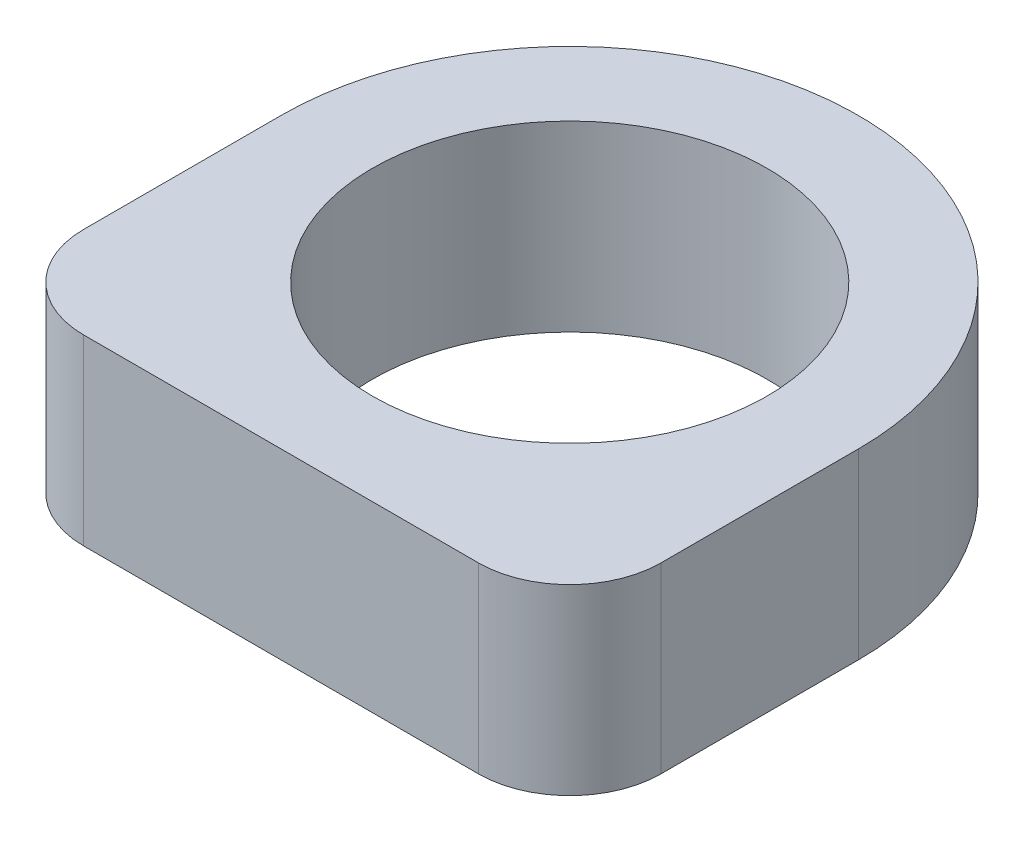
ISO-10303-21;
HEADER;
FILE_DESCRIPTION(('STEP AP214'),'2;1');
FILE_NAME('part.step','',(''),(''),'','','');
FILE_SCHEMA(('AUTOMOTIVE_DESIGN { 1 0 10303 214 1 1 1 1 }'));
ENDSEC;
DATA;
#1=APPLICATION_CONTEXT('core data for automotive mechanical design processes');
#2=APPLICATION_PROTOCOL_DEFINITION('international standard','automotive_design',2000,#1);
#3=PRODUCT_CONTEXT('',#1,'mechanical');
#4=PRODUCT('Part','Part','',(#3));
#5=PRODUCT_RELATED_PRODUCT_CATEGORY('part','',(#4));
#6=PRODUCT_DEFINITION_FORMATION('','',#4);
#7=PRODUCT_DEFINITION_CONTEXT('part definition',#1,'design');
#8=PRODUCT_DEFINITION('design','',#6,#7);
#9=PRODUCT_DEFINITION_SHAPE('','',#8);
#10=(LENGTH_UNIT() NAMED_UNIT(*) SI_UNIT(.MILLI.,.METRE.));
#11=(NAMED_UNIT(*) PLANE_ANGLE_UNIT() SI_UNIT($,.RADIAN.));
#12=(NAMED_UNIT(*) SI_UNIT($,.STERADIAN.) SOLID_ANGLE_UNIT());
#13=UNCERTAINTY_MEASURE_WITH_UNIT(LENGTH_MEASURE(1.E-05),#10,'distance_accuracy_value','');
#14=(GEOMETRIC_REPRESENTATION_CONTEXT(3) GLOBAL_UNCERTAINTY_ASSIGNED_CONTEXT((#13)) GLOBAL_UNIT_ASSIGNED_CONTEXT((#10,
#11,#12)) REPRESENTATION_CONTEXT('',''));
#15=CARTESIAN_POINT('',(0.,0.,0.));
#16=DIRECTION('',(0.,0.,1.));
#17=DIRECTION('',(1.,0.,0.));
#18=AXIS2_PLACEMENT_3D('',#15,#16,#17);
#19=CARTESIAN_POINT('',(-2.71253870759835,10.,-1.61598050665433));
#20=DIRECTION('',(0.,-1.,0.));
#21=DIRECTION('',(0.,0.,-1.));
#22=AXIS2_PLACEMENT_3D('',#19,#20,#21);
#23=CYLINDRICAL_SURFACE('',#22,15.8);
#24=CARTESIAN_POINT('',(-2.71253870759835,0.,-1.61598050665433));
#25=DIRECTION('',(0.,1.,0.));
#26=DIRECTION('',(0.,0.,1.));
#27=AXIS2_PLACEMENT_3D('',#24,#25,#26);
#28=CIRCLE('',#27,15.8);
#29=CARTESIAN_POINT('',(13.0874612924016,0.,-1.61598050665433));
#30=VERTEX_POINT('',#29);
#31=CARTESIAN_POINT('',(-18.5125387075984,0.,-1.61598050665433));
#32=VERTEX_POINT('',#31);
#33=EDGE_CURVE('E107',#30,#32,#28,.T.);
#34=ORIENTED_EDGE('',*,*,#33,.T.);
#35=DIRECTION('',(0.,-1.,0.));
#36=VECTOR('',#35,1.);
#37=CARTESIAN_POINT('',(-18.5125387075984,10.,-1.61598050665433));
#38=LINE('',#37,#36);
#39=CARTESIAN_POINT('',(-18.5125387075984,10.,-1.61598050665433));
#40=VERTEX_POINT('',#39);
#41=EDGE_CURVE('E93',#40,#32,#38,.T.);
#42=ORIENTED_EDGE('',*,*,#41,.F.);
#43=CARTESIAN_POINT('',(-2.71253870759835,10.,-1.61598050665433));
#44=DIRECTION('',(0.,1.,0.));
#45=DIRECTION('',(0.,0.,1.));
#46=AXIS2_PLACEMENT_3D('',#43,#44,#45);
#47=CIRCLE('',#46,15.8);
#48=CARTESIAN_POINT('',(13.0874612924016,10.,-1.61598050665433));
#49=VERTEX_POINT('',#48);
#50=EDGE_CURVE('E97',#49,#40,#47,.T.);
#51=ORIENTED_EDGE('',*,*,#50,.F.);
#52=DIRECTION('',(0.,-1.,0.));
#53=VECTOR('',#52,1.);
#54=CARTESIAN_POINT('',(13.0874612924016,10.,-1.61598050665433));
#55=LINE('',#54,#53);
#56=EDGE_CURVE('E109',#49,#30,#55,.T.);
#57=ORIENTED_EDGE('',*,*,#56,.T.);
#58=EDGE_LOOP('',(#34,#42,#51,#57));
#59=FACE_BOUND('',#58,.T.);
#60=ADVANCED_FACE('F35',(#59),#23,.T.);
#61=CARTESIAN_POINT('',(-18.5125387075984,10.,0.));
#62=DIRECTION('',(1.,0.,0.));
#63=DIRECTION('',(0.,0.,-1.));
#64=AXIS2_PLACEMENT_3D('',#61,#62,#63);
#65=PLANE('',#64);
#66=DIRECTION('',(0.,0.,1.));
#67=VECTOR('',#66,1.);
#68=CARTESIAN_POINT('',(-18.5125387075984,0.,0.));
#69=LINE('',#68,#67);
#70=CARTESIAN_POINT('',(-18.5125387075983,0.,9.18401949334567));
#71=VERTEX_POINT('',#70);
#72=EDGE_CURVE('E137',#32,#71,#69,.T.);
#73=ORIENTED_EDGE('',*,*,#72,.T.);
#74=DIRECTION('',(0.,-1.,0.));
#75=VECTOR('',#74,1.);
#76=CARTESIAN_POINT('',(-18.5125387075983,10.,9.18401949334567));
#77=LINE('',#76,#75);
#78=CARTESIAN_POINT('',(-18.5125387075983,10.,9.18401949334567));
#79=VERTEX_POINT('',#78);
#80=EDGE_CURVE('E58',#71,#79,#77,.F.);
#81=ORIENTED_EDGE('',*,*,#80,.T.);
#82=DIRECTION('',(0.,0.,1.));
#83=VECTOR('',#82,1.);
#84=CARTESIAN_POINT('',(-18.5125387075984,10.,0.));
#85=LINE('',#84,#83);
#86=EDGE_CURVE('E89',#40,#79,#85,.T.);
#87=ORIENTED_EDGE('',*,*,#86,.F.);
#88=ORIENTED_EDGE('',*,*,#41,.T.);
#89=EDGE_LOOP('',(#73,#81,#87,#88));
#90=FACE_BOUND('',#89,.T.);
#91=ADVANCED_FACE('F91',(#90),#65,.F.);
#92=CARTESIAN_POINT('',(0.,10.,14.1840194933457));
#93=DIRECTION('',(0.,0.,-1.));
#94=DIRECTION('',(-1.,0.,0.));
#95=AXIS2_PLACEMENT_3D('',#92,#93,#94);
#96=PLANE('',#95);
#97=DIRECTION('',(1.,0.,0.));
#98=VECTOR('',#97,1.);
#99=CARTESIAN_POINT('',(0.,10.,14.1840194933457));
#100=LINE('',#99,#98);
#101=CARTESIAN_POINT('',(-13.5125387075984,10.,14.1840194933457));
#102=VERTEX_POINT('',#101);
#103=CARTESIAN_POINT('',(8.08746129240165,10.,14.1840194933457));
#104=VERTEX_POINT('',#103);
#105=EDGE_CURVE('E96',#102,#104,#100,.T.);
#106=ORIENTED_EDGE('',*,*,#105,.F.);
#107=DIRECTION('',(0.,-1.,0.));
#108=VECTOR('',#107,1.);
#109=CARTESIAN_POINT('',(-13.5125387075984,10.,14.1840194933457));
#110=LINE('',#109,#108);
#111=CARTESIAN_POINT('',(-13.5125387075984,0.,14.1840194933457));
#112=VERTEX_POINT('',#111);
#113=EDGE_CURVE('E111',#102,#112,#110,.T.);
#114=ORIENTED_EDGE('',*,*,#113,.T.);
#115=DIRECTION('',(1.,0.,0.));
#116=VECTOR('',#115,1.);
#117=CARTESIAN_POINT('',(0.,0.,14.1840194933457));
#118=LINE('',#117,#116);
#119=CARTESIAN_POINT('',(8.08746129240165,0.,14.1840194933457));
#120=VERTEX_POINT('',#119);
#121=EDGE_CURVE('E138',#112,#120,#118,.T.);
#122=ORIENTED_EDGE('',*,*,#121,.T.);
#123=DIRECTION('',(0.,-1.,0.));
#124=VECTOR('',#123,1.);
#125=CARTESIAN_POINT('',(8.08746129240165,10.,14.1840194933457));
#126=LINE('',#125,#124);
#127=EDGE_CURVE('E108',#120,#104,#126,.F.);
#128=ORIENTED_EDGE('',*,*,#127,.T.);
#129=EDGE_LOOP('',(#106,#114,#122,#128));
#130=FACE_BOUND('',#129,.T.);
#131=ADVANCED_FACE('F128',(#130),#96,.F.);
#132=CARTESIAN_POINT('',(13.0874612924016,10.,0.));
#133=DIRECTION('',(1.,0.,0.));
#134=DIRECTION('',(0.,0.,-1.));
#135=AXIS2_PLACEMENT_3D('',#132,#133,#134);
#136=PLANE('',#135);
#137=DIRECTION('',(0.,0.,1.));
#138=VECTOR('',#137,1.);
#139=CARTESIAN_POINT('',(13.0874612924016,10.,0.));
#140=LINE('',#139,#138);
#141=CARTESIAN_POINT('',(13.0874612924017,10.,9.18401949334567));
#142=VERTEX_POINT('',#141);
#143=EDGE_CURVE('E102',#49,#142,#140,.T.);
#144=ORIENTED_EDGE('',*,*,#143,.T.);
#145=DIRECTION('',(0.,-1.,0.));
#146=VECTOR('',#145,1.);
#147=CARTESIAN_POINT('',(13.0874612924017,0.,9.18401949334567));
#148=LINE('',#147,#146);
#149=CARTESIAN_POINT('',(13.0874612924017,0.,9.18401949334567));
#150=VERTEX_POINT('',#149);
#151=EDGE_CURVE('E11',#142,#150,#148,.T.);
#152=ORIENTED_EDGE('',*,*,#151,.T.);
#153=DIRECTION('',(0.,0.,1.));
#154=VECTOR('',#153,1.);
#155=CARTESIAN_POINT('',(13.0874612924016,0.,0.));
#156=LINE('',#155,#154);
#157=EDGE_CURVE('E140',#30,#150,#156,.T.);
#158=ORIENTED_EDGE('',*,*,#157,.F.);
#159=ORIENTED_EDGE('',*,*,#56,.F.);
#160=EDGE_LOOP('',(#144,#152,#158,#159));
#161=FACE_BOUND('',#160,.T.);
#162=ADVANCED_FACE('F151',(#161),#136,.T.);
#163=CARTESIAN_POINT('',(-2.71253870759835,10.,-1.61598050665433));
#164=DIRECTION('',(0.,-1.,0.));
#165=DIRECTION('',(0.,0.,-1.));
#166=AXIS2_PLACEMENT_3D('',#163,#164,#165);
#167=CYLINDRICAL_SURFACE('',#166,10.8);
#168=CARTESIAN_POINT('',(-2.71253870759835,10.,-1.61598050665433));
#169=DIRECTION('',(0.,1.,0.));
#170=DIRECTION('',(0.,0.,1.));
#171=AXIS2_PLACEMENT_3D('',#168,#169,#170);
#172=CIRCLE('',#171,10.8);
#173=CARTESIAN_POINT('',(-2.71253870759835,10.,9.18401949334567));
#174=VERTEX_POINT('',#173);
#175=EDGE_CURVE('E113',#174,#174,#172,.T.);
#176=ORIENTED_EDGE('',*,*,#175,.T.);
#177=EDGE_LOOP('',(#176));
#178=FACE_BOUND('',#177,.T.);
#179=CARTESIAN_POINT('',(-2.71253870759835,0.,-1.61598050665433));
#180=DIRECTION('',(0.,1.,0.));
#181=DIRECTION('',(0.,0.,1.));
#182=AXIS2_PLACEMENT_3D('',#179,#180,#181);
#183=CIRCLE('',#182,10.8);
#184=CARTESIAN_POINT('',(-2.71253870759835,0.,9.18401949334567));
#185=VERTEX_POINT('',#184);
#186=EDGE_CURVE('E104',#185,#185,#183,.T.);
#187=ORIENTED_EDGE('',*,*,#186,.F.);
#188=EDGE_LOOP('',(#187));
#189=FACE_BOUND('',#188,.T.);
#190=ADVANCED_FACE('F149',(#178,#189),#167,.F.);
#191=CARTESIAN_POINT('',(0.,10.,0.));
#192=DIRECTION('',(0.,1.,0.));
#193=DIRECTION('',(0.,0.,1.));
#194=AXIS2_PLACEMENT_3D('',#191,#192,#193);
#195=PLANE('',#194);
#196=ORIENTED_EDGE('',*,*,#86,.T.);
#197=CARTESIAN_POINT('',(-13.5125387075984,10.,9.18401949334567));
#198=DIRECTION('',(0.,1.,0.));
#199=DIRECTION('',(0.,0.,1.));
#200=AXIS2_PLACEMENT_3D('',#197,#198,#199);
#201=CIRCLE('',#200,5.);
#202=EDGE_CURVE('E43',#79,#102,#201,.T.);
#203=ORIENTED_EDGE('',*,*,#202,.T.);
#204=ORIENTED_EDGE('',*,*,#105,.T.);
#205=CARTESIAN_POINT('',(8.08746129240165,10.,9.18401949334567));
#206=DIRECTION('',(0.,1.,0.));
#207=DIRECTION('',(0.,0.,1.));
#208=AXIS2_PLACEMENT_3D('',#205,#206,#207);
#209=CIRCLE('',#208,5.);
#210=EDGE_CURVE('E50',#104,#142,#209,.T.);
#211=ORIENTED_EDGE('',*,*,#210,.T.);
#212=ORIENTED_EDGE('',*,*,#143,.F.);
#213=ORIENTED_EDGE('',*,*,#50,.T.);
#214=EDGE_LOOP('',(#196,#203,#204,#211,#212,#213));
#215=FACE_BOUND('',#214,.T.);
#216=ORIENTED_EDGE('',*,*,#175,.F.);
#217=EDGE_LOOP('',(#216));
#218=FACE_BOUND('',#217,.T.);
#219=ADVANCED_FACE('F100',(#215,#218),#195,.T.);
#220=CARTESIAN_POINT('',(0.,0.,0.));
#221=DIRECTION('',(0.,1.,0.));
#222=DIRECTION('',(0.,0.,1.));
#223=AXIS2_PLACEMENT_3D('',#220,#221,#222);
#224=PLANE('',#223);
#225=ORIENTED_EDGE('',*,*,#121,.F.);
#226=CARTESIAN_POINT('',(-13.5125387075984,0.,9.18401949334567));
#227=DIRECTION('',(0.,1.,0.));
#228=DIRECTION('',(0.,0.,1.));
#229=AXIS2_PLACEMENT_3D('',#226,#227,#228);
#230=CIRCLE('',#229,5.);
#231=EDGE_CURVE('E121',#112,#71,#230,.F.);
#232=ORIENTED_EDGE('',*,*,#231,.T.);
#233=ORIENTED_EDGE('',*,*,#72,.F.);
#234=ORIENTED_EDGE('',*,*,#33,.F.);
#235=ORIENTED_EDGE('',*,*,#157,.T.);
#236=CARTESIAN_POINT('',(8.08746129240165,0.,9.18401949334567));
#237=DIRECTION('',(0.,1.,0.));
#238=DIRECTION('',(0.,0.,1.));
#239=AXIS2_PLACEMENT_3D('',#236,#237,#238);
#240=CIRCLE('',#239,5.);
#241=EDGE_CURVE('E119',#150,#120,#240,.F.);
#242=ORIENTED_EDGE('',*,*,#241,.T.);
#243=EDGE_LOOP('',(#225,#232,#233,#234,#235,#242));
#244=FACE_BOUND('',#243,.T.);
#245=ORIENTED_EDGE('',*,*,#186,.T.);
#246=EDGE_LOOP('',(#245));
#247=FACE_BOUND('',#246,.T.);
#248=ADVANCED_FACE('F135',(#244,#247),#224,.F.);
#249=CARTESIAN_POINT('',(-13.5125387075984,10.,9.18401949334567));
#250=DIRECTION('',(0.,-1.,0.));
#251=DIRECTION('',(0.,0.,-1.));
#252=AXIS2_PLACEMENT_3D('',#249,#250,#251);
#253=CYLINDRICAL_SURFACE('',#252,5.);
#254=ORIENTED_EDGE('',*,*,#202,.F.);
#255=ORIENTED_EDGE('',*,*,#80,.F.);
#256=ORIENTED_EDGE('',*,*,#231,.F.);
#257=ORIENTED_EDGE('',*,*,#113,.F.);
#258=EDGE_LOOP('',(#254,#255,#256,#257));
#259=FACE_BOUND('',#258,.T.);
#260=ADVANCED_FACE('F133',(#259),#253,.T.);
#261=CARTESIAN_POINT('',(8.08746129240165,10.,9.18401949334567));
#262=DIRECTION('',(0.,1.,0.));
#263=DIRECTION('',(0.,0.,1.));
#264=AXIS2_PLACEMENT_3D('',#261,#262,#263);
#265=CYLINDRICAL_SURFACE('',#264,5.);
#266=ORIENTED_EDGE('',*,*,#210,.F.);
#267=ORIENTED_EDGE('',*,*,#127,.F.);
#268=ORIENTED_EDGE('',*,*,#241,.F.);
#269=ORIENTED_EDGE('',*,*,#151,.F.);
#270=EDGE_LOOP('',(#266,#267,#268,#269));
#271=FACE_BOUND('',#270,.T.);
#272=ADVANCED_FACE('F37',(#271),#265,.T.);
#273=CLOSED_SHELL('',(#60,#91,#131,#162,#190,#219,#248,#260,#272));
#274=MANIFOLD_SOLID_BREP('B2',#273);
#275=ADVANCED_BREP_SHAPE_REPRESENTATION('',(#18,#274),#14);
#276=SHAPE_DEFINITION_REPRESENTATION(#9,#275);
ENDSEC;
END-ISO-10303-21;
